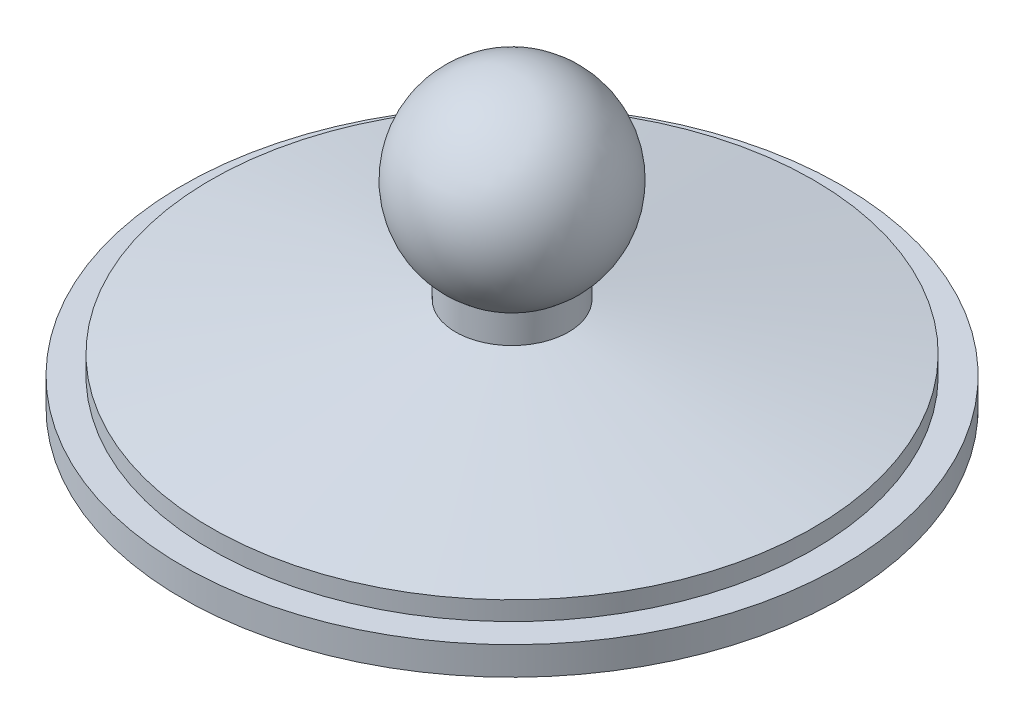
ISO-10303-21;
HEADER;
FILE_DESCRIPTION(('STEP AP214'),'2;1');
FILE_NAME('part.step','',(''),(''),'','','');
FILE_SCHEMA(('AUTOMOTIVE_DESIGN { 1 0 10303 214 1 1 1 1 }'));
ENDSEC;
DATA;
#1=APPLICATION_CONTEXT('core data for automotive mechanical design processes');
#2=APPLICATION_PROTOCOL_DEFINITION('international standard','automotive_design',2000,#1);
#3=PRODUCT_CONTEXT('',#1,'mechanical');
#4=PRODUCT('Part','Part','',(#3));
#5=PRODUCT_RELATED_PRODUCT_CATEGORY('part','',(#4));
#6=PRODUCT_DEFINITION_FORMATION('','',#4);
#7=PRODUCT_DEFINITION_CONTEXT('part definition',#1,'design');
#8=PRODUCT_DEFINITION('design','',#6,#7);
#9=PRODUCT_DEFINITION_SHAPE('','',#8);
#10=(LENGTH_UNIT() NAMED_UNIT(*) SI_UNIT(.MILLI.,.METRE.));
#11=(NAMED_UNIT(*) PLANE_ANGLE_UNIT() SI_UNIT($,.RADIAN.));
#12=(NAMED_UNIT(*) SI_UNIT($,.STERADIAN.) SOLID_ANGLE_UNIT());
#13=UNCERTAINTY_MEASURE_WITH_UNIT(LENGTH_MEASURE(1.E-05),#10,'distance_accuracy_value','');
#14=(GEOMETRIC_REPRESENTATION_CONTEXT(3) GLOBAL_UNCERTAINTY_ASSIGNED_CONTEXT((#13)) GLOBAL_UNIT_ASSIGNED_CONTEXT((#10,
#11,#12)) REPRESENTATION_CONTEXT('',''));
#15=CARTESIAN_POINT('',(0.,0.,0.));
#16=DIRECTION('',(0.,0.,1.));
#17=DIRECTION('',(1.,0.,0.));
#18=AXIS2_PLACEMENT_3D('',#15,#16,#17);
#19=CARTESIAN_POINT('',(0.,0.,0.));
#20=DIRECTION('',(0.,-1.,0.));
#21=DIRECTION('',(0.,0.,-1.));
#22=AXIS2_PLACEMENT_3D('',#19,#20,#21);
#23=PLANE('',#22);
#24=CARTESIAN_POINT('',(0.,0.,0.));
#25=DIRECTION('',(0.,-1.,0.));
#26=DIRECTION('',(0.,0.,-1.));
#27=AXIS2_PLACEMENT_3D('',#24,#25,#26);
#28=CIRCLE('',#27,29.);
#29=CARTESIAN_POINT('',(0.,0.,-29.));
#30=VERTEX_POINT('',#29);
#31=EDGE_CURVE('E80',#30,#30,#28,.T.);
#32=ORIENTED_EDGE('',*,*,#31,.F.);
#33=EDGE_LOOP('',(#32));
#34=FACE_BOUND('',#33,.T.);
#35=CARTESIAN_POINT('',(0.,0.,0.));
#36=DIRECTION('',(0.,-1.,0.));
#37=DIRECTION('',(0.,0.,-1.));
#38=AXIS2_PLACEMENT_3D('',#35,#36,#37);
#39=CIRCLE('',#38,32.);
#40=CARTESIAN_POINT('',(0.,0.,-32.));
#41=VERTEX_POINT('',#40);
#42=EDGE_CURVE('E11',#41,#41,#39,.T.);
#43=ORIENTED_EDGE('',*,*,#42,.T.);
#44=EDGE_LOOP('',(#43));
#45=FACE_BOUND('',#44,.T.);
#46=ADVANCED_FACE('F45',(#34,#45),#23,.T.);
#47=CARTESIAN_POINT('',(0.,0.,0.));
#48=DIRECTION('',(0.,-1.,0.));
#49=DIRECTION('',(0.,0.,-1.));
#50=AXIS2_PLACEMENT_3D('',#47,#48,#49);
#51=CYLINDRICAL_SURFACE('',#50,32.);
#52=CARTESIAN_POINT('',(0.,2.,0.));
#53=DIRECTION('',(0.,-1.,0.));
#54=DIRECTION('',(0.,0.,-1.));
#55=AXIS2_PLACEMENT_3D('',#52,#53,#54);
#56=CIRCLE('',#55,32.);
#57=CARTESIAN_POINT('',(0.,2.,-32.));
#58=VERTEX_POINT('',#57);
#59=EDGE_CURVE('E51',#58,#58,#56,.T.);
#60=ORIENTED_EDGE('',*,*,#59,.T.);
#61=EDGE_LOOP('',(#60));
#62=FACE_BOUND('',#61,.T.);
#63=ORIENTED_EDGE('',*,*,#42,.F.);
#64=EDGE_LOOP('',(#63));
#65=FACE_BOUND('',#64,.T.);
#66=ADVANCED_FACE('F68',(#62,#65),#51,.T.);
#67=CARTESIAN_POINT('',(32.,2.,0.));
#68=DIRECTION('',(0.,-1.,0.));
#69=DIRECTION('',(0.,0.,-1.));
#70=AXIS2_PLACEMENT_3D('',#67,#68,#69);
#71=PLANE('',#70);
#72=CARTESIAN_POINT('',(0.,2.,0.));
#73=DIRECTION('',(0.,-1.,0.));
#74=DIRECTION('',(0.,0.,-1.));
#75=AXIS2_PLACEMENT_3D('',#72,#73,#74);
#76=CIRCLE('',#75,35.);
#77=CARTESIAN_POINT('',(0.,2.,-35.));
#78=VERTEX_POINT('',#77);
#79=EDGE_CURVE('E103',#78,#78,#76,.T.);
#80=ORIENTED_EDGE('',*,*,#79,.T.);
#81=EDGE_LOOP('',(#80));
#82=FACE_BOUND('',#81,.T.);
#83=ORIENTED_EDGE('',*,*,#59,.F.);
#84=EDGE_LOOP('',(#83));
#85=FACE_BOUND('',#84,.T.);
#86=ADVANCED_FACE('F75',(#82,#85),#71,.T.);
#87=CARTESIAN_POINT('',(0.,0.,0.));
#88=DIRECTION('',(0.,-1.,0.));
#89=DIRECTION('',(0.,0.,-1.));
#90=AXIS2_PLACEMENT_3D('',#87,#88,#89);
#91=CYLINDRICAL_SURFACE('',#90,35.);
#92=CARTESIAN_POINT('',(0.,5.,0.));
#93=DIRECTION('',(0.,-1.,0.));
#94=DIRECTION('',(0.,0.,-1.));
#95=AXIS2_PLACEMENT_3D('',#92,#93,#94);
#96=CIRCLE('',#95,35.);
#97=CARTESIAN_POINT('',(0.,5.,-35.));
#98=VERTEX_POINT('',#97);
#99=EDGE_CURVE('E100',#98,#98,#96,.T.);
#100=ORIENTED_EDGE('',*,*,#99,.T.);
#101=EDGE_LOOP('',(#100));
#102=FACE_BOUND('',#101,.T.);
#103=ORIENTED_EDGE('',*,*,#79,.F.);
#104=EDGE_LOOP('',(#103));
#105=FACE_BOUND('',#104,.T.);
#106=ADVANCED_FACE('F109',(#102,#105),#91,.T.);
#107=CARTESIAN_POINT('',(35.,5.,0.));
#108=DIRECTION('',(0.,1.,0.));
#109=DIRECTION('',(0.,0.,1.));
#110=AXIS2_PLACEMENT_3D('',#107,#108,#109);
#111=PLANE('',#110);
#112=CARTESIAN_POINT('',(0.,5.,0.));
#113=DIRECTION('',(0.,-1.,0.));
#114=DIRECTION('',(0.,0.,-1.));
#115=AXIS2_PLACEMENT_3D('',#112,#113,#114);
#116=CIRCLE('',#115,32.);
#117=CARTESIAN_POINT('',(0.,5.,-32.));
#118=VERTEX_POINT('',#117);
#119=EDGE_CURVE('E97',#118,#118,#116,.T.);
#120=ORIENTED_EDGE('',*,*,#119,.T.);
#121=EDGE_LOOP('',(#120));
#122=FACE_BOUND('',#121,.T.);
#123=ORIENTED_EDGE('',*,*,#99,.F.);
#124=EDGE_LOOP('',(#123));
#125=FACE_BOUND('',#124,.T.);
#126=ADVANCED_FACE('F115',(#122,#125),#111,.T.);
#127=CARTESIAN_POINT('',(0.,0.,0.));
#128=DIRECTION('',(0.,-1.,0.));
#129=DIRECTION('',(0.,0.,-1.));
#130=AXIS2_PLACEMENT_3D('',#127,#128,#129);
#131=CYLINDRICAL_SURFACE('',#130,32.);
#132=CARTESIAN_POINT('',(0.,7.,0.));
#133=DIRECTION('',(0.,-1.,0.));
#134=DIRECTION('',(0.,0.,-1.));
#135=AXIS2_PLACEMENT_3D('',#132,#133,#134);
#136=CIRCLE('',#135,32.);
#137=CARTESIAN_POINT('',(0.,7.,-32.));
#138=VERTEX_POINT('',#137);
#139=EDGE_CURVE('E94',#138,#138,#136,.T.);
#140=ORIENTED_EDGE('',*,*,#139,.T.);
#141=EDGE_LOOP('',(#140));
#142=FACE_BOUND('',#141,.T.);
#143=ORIENTED_EDGE('',*,*,#119,.F.);
#144=EDGE_LOOP('',(#143));
#145=FACE_BOUND('',#144,.T.);
#146=ADVANCED_FACE('F121',(#142,#145),#131,.T.);
#147=CARTESIAN_POINT('',(0.,7.,0.));
#148=DIRECTION('',(0.,-1.,0.));
#149=DIRECTION('',(0.,0.,-1.));
#150=AXIS2_PLACEMENT_3D('',#147,#148,#149);
#151=CONICAL_SURFACE('',#150,32.,1.38080803887618);
#152=CARTESIAN_POINT('',(0.,12.,0.));
#153=DIRECTION('',(0.,-1.,0.));
#154=DIRECTION('',(0.,0.,-1.));
#155=AXIS2_PLACEMENT_3D('',#152,#153,#154);
#156=CIRCLE('',#155,6.);
#157=CARTESIAN_POINT('',(0.,12.,-6.00000000000001));
#158=VERTEX_POINT('',#157);
#159=EDGE_CURVE('E88',#158,#158,#156,.T.);
#160=CARTESIAN_POINT('',(0.,12.,-6.00000000000001));
#161=CARTESIAN_POINT('',(0.,11.9479166666667,-6.27083333333334));
#162=CARTESIAN_POINT('',(0.,11.8958333333333,-6.54166666666668));
#163=CARTESIAN_POINT('',(0.,11.7916666666667,-7.08333333333334));
#164=CARTESIAN_POINT('',(0.,11.7395833333333,-7.35416666666667));
#165=CARTESIAN_POINT('',(0.,11.6354166666667,-7.89583333333334));
#166=CARTESIAN_POINT('',(0.,11.5833333333333,-8.16666666666667));
#167=CARTESIAN_POINT('',(0.,11.4791666666667,-8.70833333333334));
#168=CARTESIAN_POINT('',(0.,11.4270833333333,-8.97916666666667));
#169=CARTESIAN_POINT('',(0.,11.3229166666667,-9.52083333333334));
#170=CARTESIAN_POINT('',(0.,11.2708333333333,-9.79166666666668));
#171=CARTESIAN_POINT('',(0.,11.1666666666667,-10.3333333333333));
#172=CARTESIAN_POINT('',(0.,11.1145833333333,-10.6041666666667));
#173=CARTESIAN_POINT('',(0.,11.0104166666667,-11.1458333333333));
#174=CARTESIAN_POINT('',(0.,10.9583333333333,-11.4166666666667));
#175=CARTESIAN_POINT('',(0.,10.8541666666667,-11.9583333333333));
#176=CARTESIAN_POINT('',(0.,10.8020833333333,-12.2291666666667));
#177=CARTESIAN_POINT('',(0.,10.6979166666667,-12.7708333333333));
#178=CARTESIAN_POINT('',(0.,10.6458333333333,-13.0416666666667));
#179=CARTESIAN_POINT('',(0.,10.5416666666667,-13.5833333333333));
#180=CARTESIAN_POINT('',(0.,10.4895833333333,-13.8541666666667));
#181=CARTESIAN_POINT('',(0.,10.3854166666667,-14.3958333333333));
#182=CARTESIAN_POINT('',(0.,10.3333333333333,-14.6666666666667));
#183=CARTESIAN_POINT('',(0.,10.2291666666667,-15.2083333333333));
#184=CARTESIAN_POINT('',(0.,10.1770833333333,-15.4791666666667));
#185=CARTESIAN_POINT('',(0.,10.0729166666667,-16.0208333333333));
#186=CARTESIAN_POINT('',(0.,10.0208333333333,-16.2916666666667));
#187=CARTESIAN_POINT('',(0.,9.91666666666667,-16.8333333333333));
#188=CARTESIAN_POINT('',(0.,9.86458333333333,-17.1041666666667));
#189=CARTESIAN_POINT('',(0.,9.76041666666667,-17.6458333333333));
#190=CARTESIAN_POINT('',(0.,9.70833333333333,-17.9166666666667));
#191=CARTESIAN_POINT('',(0.,9.60416666666667,-18.4583333333333));
#192=CARTESIAN_POINT('',(0.,9.55208333333333,-18.7291666666667));
#193=CARTESIAN_POINT('',(0.,9.44791666666667,-19.2708333333333));
#194=CARTESIAN_POINT('',(0.,9.39583333333333,-19.5416666666667));
#195=CARTESIAN_POINT('',(0.,9.29166666666667,-20.0833333333333));
#196=CARTESIAN_POINT('',(0.,9.23958333333333,-20.3541666666667));
#197=CARTESIAN_POINT('',(0.,9.13541666666667,-20.8958333333333));
#198=CARTESIAN_POINT('',(0.,9.08333333333333,-21.1666666666667));
#199=CARTESIAN_POINT('',(0.,8.97916666666667,-21.7083333333333));
#200=CARTESIAN_POINT('',(0.,8.92708333333333,-21.9791666666667));
#201=CARTESIAN_POINT('',(0.,8.82291666666667,-22.5208333333333));
#202=CARTESIAN_POINT('',(0.,8.77083333333333,-22.7916666666667));
#203=CARTESIAN_POINT('',(0.,8.66666666666667,-23.3333333333333));
#204=CARTESIAN_POINT('',(0.,8.61458333333333,-23.6041666666667));
#205=CARTESIAN_POINT('',(0.,8.51041666666667,-24.1458333333333));
#206=CARTESIAN_POINT('',(0.,8.45833333333333,-24.4166666666667));
#207=CARTESIAN_POINT('',(0.,8.35416666666667,-24.9583333333333));
#208=CARTESIAN_POINT('',(0.,8.30208333333333,-25.2291666666667));
#209=CARTESIAN_POINT('',(0.,8.19791666666667,-25.7708333333333));
#210=CARTESIAN_POINT('',(0.,8.14583333333333,-26.0416666666667));
#211=CARTESIAN_POINT('',(0.,8.04166666666667,-26.5833333333333));
#212=CARTESIAN_POINT('',(0.,7.98958333333333,-26.8541666666667));
#213=CARTESIAN_POINT('',(0.,7.88541666666667,-27.3958333333333));
#214=CARTESIAN_POINT('',(0.,7.83333333333333,-27.6666666666667));
#215=CARTESIAN_POINT('',(0.,7.72916666666667,-28.2083333333333));
#216=CARTESIAN_POINT('',(0.,7.67708333333333,-28.4791666666667));
#217=CARTESIAN_POINT('',(0.,7.57291666666667,-29.0208333333333));
#218=CARTESIAN_POINT('',(0.,7.52083333333333,-29.2916666666667));
#219=CARTESIAN_POINT('',(0.,7.41666666666667,-29.8333333333333));
#220=CARTESIAN_POINT('',(0.,7.36458333333333,-30.1041666666667));
#221=CARTESIAN_POINT('',(0.,7.26041666666667,-30.6458333333333));
#222=CARTESIAN_POINT('',(0.,7.20833333333333,-30.9166666666667));
#223=CARTESIAN_POINT('',(0.,7.10416666666667,-31.4583333333333));
#224=CARTESIAN_POINT('',(0.,7.05208333333333,-31.7291666666667));
#225=CARTESIAN_POINT('',(0.,7.,-32.));
#226=B_SPLINE_CURVE_WITH_KNOTS('',3,(#160,#161,#162,#163,#164,#165,#166,#167,#168,#169,#170,
#171,#172,#173,#174,#175,#176,#177,#178,#179,#180,#181,#182,#183,#184,#185,#186,#187,#188,#189,
#190,#191,#192,#193,#194,#195,#196,#197,#198,#199,#200,#201,#202,#203,#204,#205,#206,#207,#208,
#209,#210,#211,#212,#213,#214,#215,#216,#217,#218,#219,#220,#221,#222,#223,#224,#225),
.UNSPECIFIED.,.F.,.F.,(4,2,2,2,2,2,2,2,2,2,2,2,2,2,2,2,2,2,2,2,2,2,2,2,2,2,2,2,2,2,2,2,4),(0.,
0.827387643429609,1.65477528685921,2.48216293028882,3.30955057371843,4.13693821714804,
4.96432586057765,5.79171350400725,6.61910114743686,7.44648879086647,8.27387643429608,
9.10126407772568,9.92865172115529,10.7560393645849,11.5834270080145,12.4108146514441,
13.2382022948737,14.0655899383033,14.8929775817329,15.7203652251625,16.5477528685921,
17.3751405120218,18.2025281554514,19.029915798881,19.8573034423106,20.6846910857402,
21.5120787291698,22.3394663725994,23.166854016029,23.9942416594586,24.8216293028882,
25.6490169463178,26.4764045897474),.UNSPECIFIED.);
#227=EDGE_CURVE('BSEAM125',#158,#138,#226,.T.);
#228=ORIENTED_EDGE('',*,*,#159,.T.);
#229=ORIENTED_EDGE('',*,*,#139,.F.);
#230=ORIENTED_EDGE('',*,*,#227,.T.);
#231=ORIENTED_EDGE('',*,*,#227,.F.);
#232=EDGE_LOOP('',(#228,#230,#229,#231));
#233=FACE_BOUND('',#232,.T.);
#234=ADVANCED_FACE('F125',(#233),#151,.T.);
#235=CARTESIAN_POINT('',(0.,0.,0.));
#236=DIRECTION('',(0.,-1.,0.));
#237=DIRECTION('',(0.,0.,-1.));
#238=AXIS2_PLACEMENT_3D('',#235,#236,#237);
#239=CYLINDRICAL_SURFACE('',#238,6.);
#240=CARTESIAN_POINT('',(0.,15.,0.));
#241=DIRECTION('',(0.,-1.,0.));
#242=DIRECTION('',(0.,0.,-1.));
#243=AXIS2_PLACEMENT_3D('',#240,#241,#242);
#244=CIRCLE('',#243,6.);
#245=CARTESIAN_POINT('',(0.,15.,-6.));
#246=VERTEX_POINT('',#245);
#247=EDGE_CURVE('E84',#246,#246,#244,.T.);
#248=ORIENTED_EDGE('',*,*,#247,.T.);
#249=EDGE_LOOP('',(#248));
#250=FACE_BOUND('',#249,.T.);
#251=ORIENTED_EDGE('',*,*,#159,.F.);
#252=EDGE_LOOP('',(#251));
#253=FACE_BOUND('',#252,.T.);
#254=ADVANCED_FACE('F129',(#250,#253),#239,.T.);
#255=CARTESIAN_POINT('',(0.,23.,0.));
#256=DIRECTION('',(0.,-1.,0.));
#257=DIRECTION('',(1.,0.,0.));
#258=AXIS2_PLACEMENT_3D('',#255,#256,#257);
#259=SPHERICAL_SURFACE('',#258,10.);
#260=ORIENTED_EDGE('',*,*,#247,.F.);
#261=EDGE_LOOP('',(#260));
#262=FACE_BOUND('',#261,.T.);
#263=ADVANCED_FACE('F62',(#262),#259,.T.);
#264=CARTESIAN_POINT('',(0.,0.,0.));
#265=DIRECTION('',(0.,-1.,0.));
#266=DIRECTION('',(0.,0.,-1.));
#267=AXIS2_PLACEMENT_3D('',#264,#265,#266);
#268=CYLINDRICAL_SURFACE('',#267,29.);
#269=CARTESIAN_POINT('',(0.,4.5219533165676,0.));
#270=DIRECTION('',(0.,-1.,0.));
#271=DIRECTION('',(0.,0.,-1.));
#272=AXIS2_PLACEMENT_3D('',#269,#270,#271);
#273=CIRCLE('',#272,29.);
#274=CARTESIAN_POINT('',(0.,4.5219533165676,-29.));
#275=VERTEX_POINT('',#274);
#276=EDGE_CURVE('E85',#275,#275,#273,.T.);
#277=ORIENTED_EDGE('',*,*,#276,.F.);
#278=EDGE_LOOP('',(#277));
#279=FACE_BOUND('',#278,.T.);
#280=ORIENTED_EDGE('',*,*,#31,.T.);
#281=EDGE_LOOP('',(#280));
#282=FACE_BOUND('',#281,.T.);
#283=ADVANCED_FACE('F56',(#279,#282),#268,.F.);
#284=CARTESIAN_POINT('',(0.,4.05398065905806,0.));
#285=DIRECTION('',(0.,-1.,0.));
#286=DIRECTION('',(0.,0.,-1.));
#287=AXIS2_PLACEMENT_3D('',#284,#285,#286);
#288=CONICAL_SURFACE('',#287,31.4334578190496,1.38080803887618);
#289=ORIENTED_EDGE('',*,*,#276,.T.);
#290=EDGE_LOOP('',(#289));
#291=FACE_BOUND('',#290,.T.);
#292=CARTESIAN_POINT('',(0.,10.0988763934907,0.));
#293=VERTEX_POINT('',#292);
#294=VERTEX_LOOP('',#293);
#295=FACE_BOUND('',#294,.T.);
#296=ADVANCED_FACE('F54',(#291,#295),#288,.F.);
#297=CLOSED_SHELL('',(#46,#66,#86,#106,#126,#146,#234,#254,#263,#283,#296));
#298=MANIFOLD_SOLID_BREP('B2',#297);
#299=ADVANCED_BREP_SHAPE_REPRESENTATION('',(#18,#298),#14);
#300=SHAPE_DEFINITION_REPRESENTATION(#9,#299);
ENDSEC;
END-ISO-10303-21;
